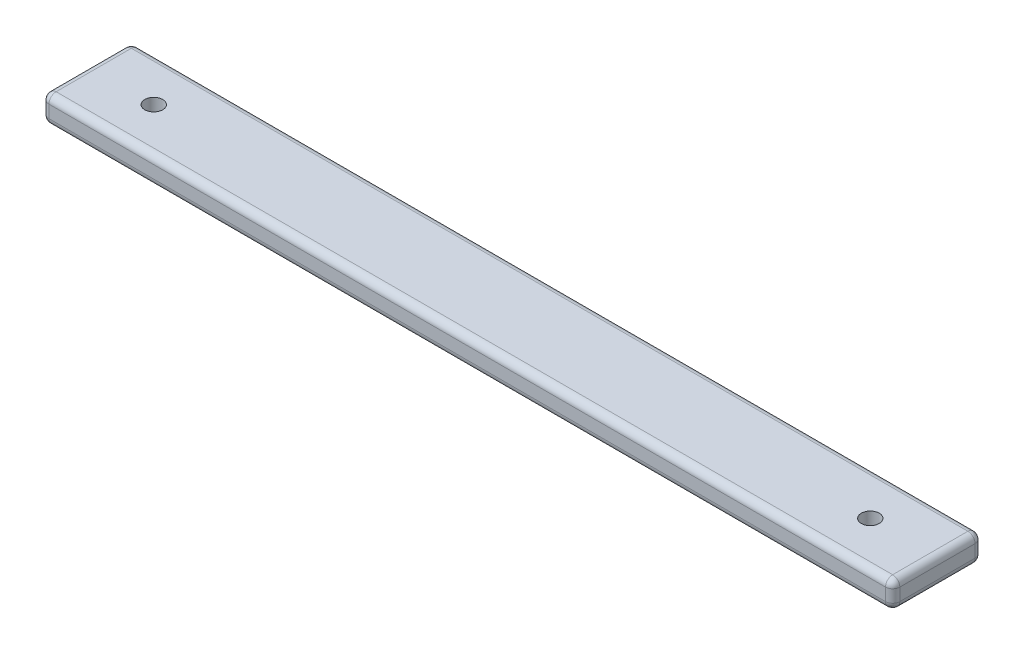
ISO-10303-21;
HEADER;
FILE_DESCRIPTION(('STEP AP214'),'2;1');
FILE_NAME('part.step','',(''),(''),'','','');
FILE_SCHEMA(('AUTOMOTIVE_DESIGN { 1 0 10303 214 1 1 1 1 }'));
ENDSEC;
DATA;
#1=APPLICATION_CONTEXT('core data for automotive mechanical design processes');
#2=APPLICATION_PROTOCOL_DEFINITION('international standard','automotive_design',2000,#1);
#3=PRODUCT_CONTEXT('',#1,'mechanical');
#4=PRODUCT('Part','Part','',(#3));
#5=PRODUCT_RELATED_PRODUCT_CATEGORY('part','',(#4));
#6=PRODUCT_DEFINITION_FORMATION('','',#4);
#7=PRODUCT_DEFINITION_CONTEXT('part definition',#1,'design');
#8=PRODUCT_DEFINITION('design','',#6,#7);
#9=PRODUCT_DEFINITION_SHAPE('','',#8);
#10=(LENGTH_UNIT() NAMED_UNIT(*) SI_UNIT(.MILLI.,.METRE.));
#11=(NAMED_UNIT(*) PLANE_ANGLE_UNIT() SI_UNIT($,.RADIAN.));
#12=(NAMED_UNIT(*) SI_UNIT($,.STERADIAN.) SOLID_ANGLE_UNIT());
#13=UNCERTAINTY_MEASURE_WITH_UNIT(LENGTH_MEASURE(1.E-05),#10,'distance_accuracy_value','');
#14=(GEOMETRIC_REPRESENTATION_CONTEXT(3) GLOBAL_UNCERTAINTY_ASSIGNED_CONTEXT((#13)) GLOBAL_UNIT_ASSIGNED_CONTEXT((#10,
#11,#12)) REPRESENTATION_CONTEXT('',''));
#15=CARTESIAN_POINT('',(0.,0.,0.));
#16=DIRECTION('',(0.,0.,1.));
#17=DIRECTION('',(1.,0.,0.));
#18=AXIS2_PLACEMENT_3D('',#15,#16,#17);
#19=CARTESIAN_POINT('',(47.5,3.,-5.));
#20=DIRECTION('',(-1.,0.,0.));
#21=DIRECTION('',(0.,0.,1.));
#22=AXIS2_PLACEMENT_3D('',#19,#20,#21);
#23=PLANE('',#22);
#24=DIRECTION('',(0.,0.,-1.));
#25=VECTOR('',#24,1.);
#26=CARTESIAN_POINT('',(47.5,2.2,5.));
#27=LINE('',#26,#25);
#28=CARTESIAN_POINT('',(47.5,2.2,-4.2));
#29=VERTEX_POINT('',#28);
#30=CARTESIAN_POINT('',(47.5,2.2,4.2));
#31=VERTEX_POINT('',#30);
#32=EDGE_CURVE('E234',#29,#31,#27,.F.);
#33=ORIENTED_EDGE('',*,*,#32,.T.);
#34=DIRECTION('',(0.,-1.,0.));
#35=VECTOR('',#34,1.);
#36=CARTESIAN_POINT('',(47.5,3.,4.2));
#37=LINE('',#36,#35);
#38=CARTESIAN_POINT('',(47.5,0.8,4.2));
#39=VERTEX_POINT('',#38);
#40=EDGE_CURVE('E11',#31,#39,#37,.T.);
#41=ORIENTED_EDGE('',*,*,#40,.T.);
#42=DIRECTION('',(0.,0.,-1.));
#43=VECTOR('',#42,1.);
#44=CARTESIAN_POINT('',(47.5,0.8,-5.));
#45=LINE('',#44,#43);
#46=CARTESIAN_POINT('',(47.5,0.8,-4.2));
#47=VERTEX_POINT('',#46);
#48=EDGE_CURVE('E236',#39,#47,#45,.T.);
#49=ORIENTED_EDGE('',*,*,#48,.T.);
#50=DIRECTION('',(0.,-1.,0.));
#51=VECTOR('',#50,1.);
#52=CARTESIAN_POINT('',(47.5,3.,-4.2));
#53=LINE('',#52,#51);
#54=EDGE_CURVE('E44',#47,#29,#53,.F.);
#55=ORIENTED_EDGE('',*,*,#54,.T.);
#56=EDGE_LOOP('',(#33,#41,#49,#55));
#57=FACE_BOUND('',#56,.T.);
#58=ADVANCED_FACE('F35',(#57),#23,.F.);
#59=CARTESIAN_POINT('',(-47.5,3.,-5.));
#60=DIRECTION('',(0.,0.,1.));
#61=DIRECTION('',(1.,0.,0.));
#62=AXIS2_PLACEMENT_3D('',#59,#60,#61);
#63=PLANE('',#62);
#64=DIRECTION('',(-1.,0.,0.));
#65=VECTOR('',#64,1.);
#66=CARTESIAN_POINT('',(-47.5,0.8,-5.));
#67=LINE('',#66,#65);
#68=CARTESIAN_POINT('',(46.7,0.8,-5.));
#69=VERTEX_POINT('',#68);
#70=CARTESIAN_POINT('',(-46.7,0.8,-5.));
#71=VERTEX_POINT('',#70);
#72=EDGE_CURVE('E133',#69,#71,#67,.T.);
#73=ORIENTED_EDGE('',*,*,#72,.T.);
#74=DIRECTION('',(0.,-1.,0.));
#75=VECTOR('',#74,1.);
#76=CARTESIAN_POINT('',(-46.7,3.,-5.));
#77=LINE('',#76,#75);
#78=CARTESIAN_POINT('',(-46.7,2.2,-5.));
#79=VERTEX_POINT('',#78);
#80=EDGE_CURVE('E175',#71,#79,#77,.F.);
#81=ORIENTED_EDGE('',*,*,#80,.T.);
#82=DIRECTION('',(-1.,0.,0.));
#83=VECTOR('',#82,1.);
#84=CARTESIAN_POINT('',(47.5,2.2,-5.));
#85=LINE('',#84,#83);
#86=CARTESIAN_POINT('',(46.7,2.2,-5.));
#87=VERTEX_POINT('',#86);
#88=EDGE_CURVE('E184',#79,#87,#85,.F.);
#89=ORIENTED_EDGE('',*,*,#88,.T.);
#90=DIRECTION('',(0.,-1.,0.));
#91=VECTOR('',#90,1.);
#92=CARTESIAN_POINT('',(46.7,3.,-5.));
#93=LINE('',#92,#91);
#94=EDGE_CURVE('E173',#87,#69,#93,.T.);
#95=ORIENTED_EDGE('',*,*,#94,.T.);
#96=EDGE_LOOP('',(#73,#81,#89,#95));
#97=FACE_BOUND('',#96,.T.);
#98=ADVANCED_FACE('F340',(#97),#63,.F.);
#99=CARTESIAN_POINT('',(-47.5,3.,-5.));
#100=DIRECTION('',(1.,0.,0.));
#101=DIRECTION('',(0.,0.,-1.));
#102=AXIS2_PLACEMENT_3D('',#99,#100,#101);
#103=PLANE('',#102);
#104=DIRECTION('',(0.,0.,1.));
#105=VECTOR('',#104,1.);
#106=CARTESIAN_POINT('',(-47.5,0.8,-5.));
#107=LINE('',#106,#105);
#108=CARTESIAN_POINT('',(-47.5,0.8,-4.2));
#109=VERTEX_POINT('',#108);
#110=CARTESIAN_POINT('',(-47.5,0.8,4.2));
#111=VERTEX_POINT('',#110);
#112=EDGE_CURVE('E225',#109,#111,#107,.T.);
#113=ORIENTED_EDGE('',*,*,#112,.T.);
#114=DIRECTION('',(0.,-1.,0.));
#115=VECTOR('',#114,1.);
#116=CARTESIAN_POINT('',(-47.5,3.,4.2));
#117=LINE('',#116,#115);
#118=CARTESIAN_POINT('',(-47.5,2.2,4.2));
#119=VERTEX_POINT('',#118);
#120=EDGE_CURVE('E171',#111,#119,#117,.F.);
#121=ORIENTED_EDGE('',*,*,#120,.T.);
#122=DIRECTION('',(0.,0.,1.));
#123=VECTOR('',#122,1.);
#124=CARTESIAN_POINT('',(-47.5,2.2,-5.));
#125=LINE('',#124,#123);
#126=CARTESIAN_POINT('',(-47.5,2.2,-4.2));
#127=VERTEX_POINT('',#126);
#128=EDGE_CURVE('E155',#119,#127,#125,.F.);
#129=ORIENTED_EDGE('',*,*,#128,.T.);
#130=DIRECTION('',(0.,-1.,0.));
#131=VECTOR('',#130,1.);
#132=CARTESIAN_POINT('',(-47.5,3.,-4.2));
#133=LINE('',#132,#131);
#134=EDGE_CURVE('E169',#127,#109,#133,.T.);
#135=ORIENTED_EDGE('',*,*,#134,.T.);
#136=EDGE_LOOP('',(#113,#121,#129,#135));
#137=FACE_BOUND('',#136,.T.);
#138=ADVANCED_FACE('F301',(#137),#103,.F.);
#139=CARTESIAN_POINT('',(-47.5,3.,5.));
#140=DIRECTION('',(0.,0.,-1.));
#141=DIRECTION('',(-1.,0.,0.));
#142=AXIS2_PLACEMENT_3D('',#139,#140,#141);
#143=PLANE('',#142);
#144=DIRECTION('',(1.,0.,0.));
#145=VECTOR('',#144,1.);
#146=CARTESIAN_POINT('',(-47.5,2.2,5.));
#147=LINE('',#146,#145);
#148=CARTESIAN_POINT('',(46.7,2.2,5.));
#149=VERTEX_POINT('',#148);
#150=CARTESIAN_POINT('',(-46.7,2.2,5.));
#151=VERTEX_POINT('',#150);
#152=EDGE_CURVE('E228',#149,#151,#147,.F.);
#153=ORIENTED_EDGE('',*,*,#152,.T.);
#154=DIRECTION('',(0.,-1.,0.));
#155=VECTOR('',#154,1.);
#156=CARTESIAN_POINT('',(-46.7,3.,5.));
#157=LINE('',#156,#155);
#158=CARTESIAN_POINT('',(-46.7,0.8,5.));
#159=VERTEX_POINT('',#158);
#160=EDGE_CURVE('E167',#151,#159,#157,.T.);
#161=ORIENTED_EDGE('',*,*,#160,.T.);
#162=DIRECTION('',(1.,0.,0.));
#163=VECTOR('',#162,1.);
#164=CARTESIAN_POINT('',(-47.5,0.8,5.));
#165=LINE('',#164,#163);
#166=CARTESIAN_POINT('',(46.7,0.8,5.));
#167=VERTEX_POINT('',#166);
#168=EDGE_CURVE('E231',#159,#167,#165,.T.);
#169=ORIENTED_EDGE('',*,*,#168,.T.);
#170=DIRECTION('',(0.,-1.,0.));
#171=VECTOR('',#170,1.);
#172=CARTESIAN_POINT('',(46.7,3.,5.));
#173=LINE('',#172,#171);
#174=EDGE_CURVE('E160',#167,#149,#173,.F.);
#175=ORIENTED_EDGE('',*,*,#174,.T.);
#176=EDGE_LOOP('',(#153,#161,#169,#175));
#177=FACE_BOUND('',#176,.T.);
#178=ADVANCED_FACE('F330',(#177),#143,.F.);
#179=CARTESIAN_POINT('',(0.,3.,0.));
#180=DIRECTION('',(0.,1.,0.));
#181=DIRECTION('',(0.,0.,1.));
#182=AXIS2_PLACEMENT_3D('',#179,#180,#181);
#183=PLANE('',#182);
#184=CARTESIAN_POINT('',(40.,3.,0.));
#185=DIRECTION('',(0.,1.,0.));
#186=DIRECTION('',(0.,0.,1.));
#187=AXIS2_PLACEMENT_3D('',#184,#185,#186);
#188=CIRCLE('',#187,0.999999999999998);
#189=CARTESIAN_POINT('',(40.,3.,0.999999999999983));
#190=VERTEX_POINT('',#189);
#191=EDGE_CURVE('E214',#190,#190,#188,.T.);
#192=ORIENTED_EDGE('',*,*,#191,.F.);
#193=EDGE_LOOP('',(#192));
#194=FACE_BOUND('',#193,.T.);
#195=CARTESIAN_POINT('',(-40.,3.,0.));
#196=DIRECTION('',(0.,1.,0.));
#197=DIRECTION('',(0.,0.,1.));
#198=AXIS2_PLACEMENT_3D('',#195,#196,#197);
#199=CIRCLE('',#198,0.999999999999998);
#200=CARTESIAN_POINT('',(-40.,3.,0.999999999999998));
#201=VERTEX_POINT('',#200);
#202=EDGE_CURVE('E201',#201,#201,#199,.T.);
#203=ORIENTED_EDGE('',*,*,#202,.F.);
#204=EDGE_LOOP('',(#203));
#205=FACE_BOUND('',#204,.T.);
#206=DIRECTION('',(0.,0.,1.));
#207=VECTOR('',#206,1.);
#208=CARTESIAN_POINT('',(-46.7,3.,5.));
#209=LINE('',#208,#207);
#210=CARTESIAN_POINT('',(-46.7,3.,-4.2));
#211=VERTEX_POINT('',#210);
#212=CARTESIAN_POINT('',(-46.7,3.,4.2));
#213=VERTEX_POINT('',#212);
#214=EDGE_CURVE('E244',#211,#213,#209,.T.);
#215=ORIENTED_EDGE('',*,*,#214,.T.);
#216=DIRECTION('',(1.,0.,0.));
#217=VECTOR('',#216,1.);
#218=CARTESIAN_POINT('',(47.5,3.,4.2));
#219=LINE('',#218,#217);
#220=CARTESIAN_POINT('',(46.7,3.,4.2));
#221=VERTEX_POINT('',#220);
#222=EDGE_CURVE('E247',#213,#221,#219,.T.);
#223=ORIENTED_EDGE('',*,*,#222,.T.);
#224=DIRECTION('',(0.,0.,-1.));
#225=VECTOR('',#224,1.);
#226=CARTESIAN_POINT('',(46.7,3.,-5.));
#227=LINE('',#226,#225);
#228=CARTESIAN_POINT('',(46.7,3.,-4.2));
#229=VERTEX_POINT('',#228);
#230=EDGE_CURVE('E238',#221,#229,#227,.T.);
#231=ORIENTED_EDGE('',*,*,#230,.T.);
#232=DIRECTION('',(-1.,0.,0.));
#233=VECTOR('',#232,1.);
#234=CARTESIAN_POINT('',(-47.5,3.,-4.2));
#235=LINE('',#234,#233);
#236=EDGE_CURVE('E241',#229,#211,#235,.T.);
#237=ORIENTED_EDGE('',*,*,#236,.T.);
#238=EDGE_LOOP('',(#215,#223,#231,#237));
#239=FACE_BOUND('',#238,.T.);
#240=ADVANCED_FACE('F279',(#194,#205,#239),#183,.T.);
#241=CARTESIAN_POINT('',(0.,0.,0.));
#242=DIRECTION('',(0.,1.,0.));
#243=DIRECTION('',(0.,0.,1.));
#244=AXIS2_PLACEMENT_3D('',#241,#242,#243);
#245=PLANE('',#244);
#246=CARTESIAN_POINT('',(40.,0.,0.));
#247=DIRECTION('',(0.,1.,0.));
#248=DIRECTION('',(0.,0.,1.));
#249=AXIS2_PLACEMENT_3D('',#246,#247,#248);
#250=CIRCLE('',#249,0.999999999999998);
#251=CARTESIAN_POINT('',(40.,0.,0.999999999999983));
#252=VERTEX_POINT('',#251);
#253=EDGE_CURVE('E206',#252,#252,#250,.T.);
#254=ORIENTED_EDGE('',*,*,#253,.T.);
#255=EDGE_LOOP('',(#254));
#256=FACE_BOUND('',#255,.T.);
#257=CARTESIAN_POINT('',(-40.,0.,0.));
#258=DIRECTION('',(0.,1.,0.));
#259=DIRECTION('',(0.,0.,1.));
#260=AXIS2_PLACEMENT_3D('',#257,#258,#259);
#261=CIRCLE('',#260,0.999999999999998);
#262=CARTESIAN_POINT('',(-40.,0.,0.999999999999998));
#263=VERTEX_POINT('',#262);
#264=EDGE_CURVE('E196',#263,#263,#261,.T.);
#265=ORIENTED_EDGE('',*,*,#264,.T.);
#266=EDGE_LOOP('',(#265));
#267=FACE_BOUND('',#266,.T.);
#268=DIRECTION('',(0.,0.,1.));
#269=VECTOR('',#268,1.);
#270=CARTESIAN_POINT('',(-46.7,0.,0.));
#271=LINE('',#270,#269);
#272=CARTESIAN_POINT('',(-46.7,0.,4.2));
#273=VERTEX_POINT('',#272);
#274=CARTESIAN_POINT('',(-46.7,0.,-4.2));
#275=VERTEX_POINT('',#274);
#276=EDGE_CURVE('E154',#273,#275,#271,.F.);
#277=ORIENTED_EDGE('',*,*,#276,.T.);
#278=DIRECTION('',(-1.,0.,0.));
#279=VECTOR('',#278,1.);
#280=CARTESIAN_POINT('',(0.,0.,-4.2));
#281=LINE('',#280,#279);
#282=CARTESIAN_POINT('',(46.7,0.,-4.2));
#283=VERTEX_POINT('',#282);
#284=EDGE_CURVE('E130',#275,#283,#281,.F.);
#285=ORIENTED_EDGE('',*,*,#284,.T.);
#286=DIRECTION('',(0.,0.,-1.));
#287=VECTOR('',#286,1.);
#288=CARTESIAN_POINT('',(46.7,0.,0.));
#289=LINE('',#288,#287);
#290=CARTESIAN_POINT('',(46.7,0.,4.2));
#291=VERTEX_POINT('',#290);
#292=EDGE_CURVE('E141',#283,#291,#289,.F.);
#293=ORIENTED_EDGE('',*,*,#292,.T.);
#294=DIRECTION('',(1.,0.,0.));
#295=VECTOR('',#294,1.);
#296=CARTESIAN_POINT('',(0.,0.,4.2));
#297=LINE('',#296,#295);
#298=EDGE_CURVE('E148',#291,#273,#297,.F.);
#299=ORIENTED_EDGE('',*,*,#298,.T.);
#300=EDGE_LOOP('',(#277,#285,#293,#299));
#301=FACE_BOUND('',#300,.T.);
#302=CARTESIAN_POINT('',(0.,0.,0.));
#303=DIRECTION('',(0.,1.,0.));
#304=DIRECTION('',(0.,0.,1.));
#305=AXIS2_PLACEMENT_3D('',#302,#303,#304);
#306=CIRCLE('',#305,0.678596161892558);
#307=CARTESIAN_POINT('',(0.,0.,-0.678596161892558));
#308=VERTEX_POINT('',#307);
#309=EDGE_CURVE('E217',#308,#308,#306,.F.);
#310=ORIENTED_EDGE('',*,*,#309,.F.);
#311=EDGE_LOOP('',(#310));
#312=FACE_BOUND('',#311,.T.);
#313=ADVANCED_FACE('F151',(#256,#267,#301,#312),#245,.F.);
#314=CARTESIAN_POINT('',(-47.5,0.8,4.2));
#315=DIRECTION('',(1.,0.,0.));
#316=DIRECTION('',(0.,0.,-1.));
#317=AXIS2_PLACEMENT_3D('',#314,#315,#316);
#318=CYLINDRICAL_SURFACE('',#317,0.8);
#319=ORIENTED_EDGE('',*,*,#168,.F.);
#320=CARTESIAN_POINT('',(-46.7,0.8,4.2));
#321=DIRECTION('',(1.,0.,0.));
#322=DIRECTION('',(0.,0.,-1.));
#323=AXIS2_PLACEMENT_3D('',#320,#321,#322);
#324=CIRCLE('',#323,0.8);
#325=EDGE_CURVE('E267',#159,#273,#324,.T.);
#326=ORIENTED_EDGE('',*,*,#325,.T.);
#327=ORIENTED_EDGE('',*,*,#298,.F.);
#328=CARTESIAN_POINT('',(46.7,0.8,4.2));
#329=DIRECTION('',(1.,0.,0.));
#330=DIRECTION('',(0.,0.,-1.));
#331=AXIS2_PLACEMENT_3D('',#328,#329,#330);
#332=CIRCLE('',#331,0.8);
#333=EDGE_CURVE('E265',#291,#167,#332,.F.);
#334=ORIENTED_EDGE('',*,*,#333,.T.);
#335=EDGE_LOOP('',(#319,#326,#327,#334));
#336=FACE_BOUND('',#335,.T.);
#337=ADVANCED_FACE('F327',(#336),#318,.T.);
#338=CARTESIAN_POINT('',(46.7,0.8,-5.));
#339=DIRECTION('',(0.,0.,-1.));
#340=DIRECTION('',(-1.,0.,0.));
#341=AXIS2_PLACEMENT_3D('',#338,#339,#340);
#342=CYLINDRICAL_SURFACE('',#341,0.8);
#343=ORIENTED_EDGE('',*,*,#48,.F.);
#344=CARTESIAN_POINT('',(46.7,0.8,4.2));
#345=DIRECTION('',(0.,0.,-1.));
#346=DIRECTION('',(-1.,0.,0.));
#347=AXIS2_PLACEMENT_3D('',#344,#345,#346);
#348=CIRCLE('',#347,0.8);
#349=EDGE_CURVE('E144',#39,#291,#348,.T.);
#350=ORIENTED_EDGE('',*,*,#349,.T.);
#351=ORIENTED_EDGE('',*,*,#292,.F.);
#352=CARTESIAN_POINT('',(46.7,0.8,-4.2));
#353=DIRECTION('',(0.,0.,-1.));
#354=DIRECTION('',(-1.,0.,0.));
#355=AXIS2_PLACEMENT_3D('',#352,#353,#354);
#356=CIRCLE('',#355,0.8);
#357=EDGE_CURVE('E52',#283,#47,#356,.F.);
#358=ORIENTED_EDGE('',*,*,#357,.T.);
#359=EDGE_LOOP('',(#343,#350,#351,#358));
#360=FACE_BOUND('',#359,.T.);
#361=ADVANCED_FACE('F142',(#360),#342,.T.);
#362=CARTESIAN_POINT('',(-46.7,0.8,-5.));
#363=DIRECTION('',(0.,0.,1.));
#364=DIRECTION('',(1.,0.,0.));
#365=AXIS2_PLACEMENT_3D('',#362,#363,#364);
#366=CYLINDRICAL_SURFACE('',#365,0.8);
#367=ORIENTED_EDGE('',*,*,#276,.F.);
#368=CARTESIAN_POINT('',(-46.7,0.8,4.2));
#369=DIRECTION('',(0.,0.,1.));
#370=DIRECTION('',(1.,0.,0.));
#371=AXIS2_PLACEMENT_3D('',#368,#369,#370);
#372=CIRCLE('',#371,0.8);
#373=EDGE_CURVE('E263',#273,#111,#372,.F.);
#374=ORIENTED_EDGE('',*,*,#373,.T.);
#375=ORIENTED_EDGE('',*,*,#112,.F.);
#376=CARTESIAN_POINT('',(-46.7,0.8,-4.2));
#377=DIRECTION('',(0.,0.,1.));
#378=DIRECTION('',(1.,0.,0.));
#379=AXIS2_PLACEMENT_3D('',#376,#377,#378);
#380=CIRCLE('',#379,0.8);
#381=EDGE_CURVE('E261',#109,#275,#380,.T.);
#382=ORIENTED_EDGE('',*,*,#381,.T.);
#383=EDGE_LOOP('',(#367,#374,#375,#382));
#384=FACE_BOUND('',#383,.T.);
#385=ADVANCED_FACE('F353',(#384),#366,.T.);
#386=CARTESIAN_POINT('',(-47.5,0.8,-4.2));
#387=DIRECTION('',(-1.,0.,0.));
#388=DIRECTION('',(0.,0.,1.));
#389=AXIS2_PLACEMENT_3D('',#386,#387,#388);
#390=CYLINDRICAL_SURFACE('',#389,0.8);
#391=ORIENTED_EDGE('',*,*,#284,.F.);
#392=CARTESIAN_POINT('',(-46.7,0.8,-4.2));
#393=DIRECTION('',(-1.,0.,0.));
#394=DIRECTION('',(0.,0.,1.));
#395=AXIS2_PLACEMENT_3D('',#392,#393,#394);
#396=CIRCLE('',#395,0.8);
#397=EDGE_CURVE('E137',#275,#71,#396,.F.);
#398=ORIENTED_EDGE('',*,*,#397,.T.);
#399=ORIENTED_EDGE('',*,*,#72,.F.);
#400=CARTESIAN_POINT('',(46.7,0.8,-4.2));
#401=DIRECTION('',(-1.,0.,0.));
#402=DIRECTION('',(0.,0.,1.));
#403=AXIS2_PLACEMENT_3D('',#400,#401,#402);
#404=CIRCLE('',#403,0.8);
#405=EDGE_CURVE('E127',#69,#283,#404,.T.);
#406=ORIENTED_EDGE('',*,*,#405,.T.);
#407=EDGE_LOOP('',(#391,#398,#399,#406));
#408=FACE_BOUND('',#407,.T.);
#409=ADVANCED_FACE('F128',(#408),#390,.T.);
#410=CARTESIAN_POINT('',(0.,2.2,-4.2));
#411=DIRECTION('',(1.,0.,0.));
#412=DIRECTION('',(0.,0.,-1.));
#413=AXIS2_PLACEMENT_3D('',#410,#411,#412);
#414=CYLINDRICAL_SURFACE('',#413,0.8);
#415=ORIENTED_EDGE('',*,*,#88,.F.);
#416=CARTESIAN_POINT('',(-46.7,2.2,-4.2));
#417=DIRECTION('',(1.,0.,0.));
#418=DIRECTION('',(0.,0.,-1.));
#419=AXIS2_PLACEMENT_3D('',#416,#417,#418);
#420=CIRCLE('',#419,0.8);
#421=EDGE_CURVE('E138',#79,#211,#420,.T.);
#422=ORIENTED_EDGE('',*,*,#421,.T.);
#423=ORIENTED_EDGE('',*,*,#236,.F.);
#424=CARTESIAN_POINT('',(46.7,2.2,-4.2));
#425=DIRECTION('',(1.,0.,0.));
#426=DIRECTION('',(0.,0.,-1.));
#427=AXIS2_PLACEMENT_3D('',#424,#425,#426);
#428=CIRCLE('',#427,0.8);
#429=EDGE_CURVE('E269',#229,#87,#428,.F.);
#430=ORIENTED_EDGE('',*,*,#429,.T.);
#431=EDGE_LOOP('',(#415,#422,#423,#430));
#432=FACE_BOUND('',#431,.T.);
#433=ADVANCED_FACE('F284',(#432),#414,.T.);
#434=CARTESIAN_POINT('',(-46.7,2.2,0.));
#435=DIRECTION('',(0.,0.,-1.));
#436=DIRECTION('',(-1.,0.,0.));
#437=AXIS2_PLACEMENT_3D('',#434,#435,#436);
#438=CYLINDRICAL_SURFACE('',#437,0.8);
#439=ORIENTED_EDGE('',*,*,#128,.F.);
#440=CARTESIAN_POINT('',(-46.7,2.2,4.2));
#441=DIRECTION('',(0.,0.,-1.));
#442=DIRECTION('',(-1.,0.,0.));
#443=AXIS2_PLACEMENT_3D('',#440,#441,#442);
#444=CIRCLE('',#443,0.8);
#445=EDGE_CURVE('E259',#119,#213,#444,.T.);
#446=ORIENTED_EDGE('',*,*,#445,.T.);
#447=ORIENTED_EDGE('',*,*,#214,.F.);
#448=CARTESIAN_POINT('',(-46.7,2.2,-4.2));
#449=DIRECTION('',(0.,0.,-1.));
#450=DIRECTION('',(-1.,0.,0.));
#451=AXIS2_PLACEMENT_3D('',#448,#449,#450);
#452=CIRCLE('',#451,0.8);
#453=EDGE_CURVE('E256',#211,#127,#452,.F.);
#454=ORIENTED_EDGE('',*,*,#453,.T.);
#455=EDGE_LOOP('',(#439,#446,#447,#454));
#456=FACE_BOUND('',#455,.T.);
#457=ADVANCED_FACE('F299',(#456),#438,.T.);
#458=CARTESIAN_POINT('',(46.7,2.2,0.));
#459=DIRECTION('',(0.,0.,1.));
#460=DIRECTION('',(1.,0.,0.));
#461=AXIS2_PLACEMENT_3D('',#458,#459,#460);
#462=CYLINDRICAL_SURFACE('',#461,0.8);
#463=ORIENTED_EDGE('',*,*,#230,.F.);
#464=CARTESIAN_POINT('',(46.7,2.2,4.2));
#465=DIRECTION('',(0.,0.,1.));
#466=DIRECTION('',(1.,0.,0.));
#467=AXIS2_PLACEMENT_3D('',#464,#465,#466);
#468=CIRCLE('',#467,0.8);
#469=EDGE_CURVE('E158',#221,#31,#468,.F.);
#470=ORIENTED_EDGE('',*,*,#469,.T.);
#471=ORIENTED_EDGE('',*,*,#32,.F.);
#472=CARTESIAN_POINT('',(46.7,2.2,-4.2));
#473=DIRECTION('',(0.,0.,1.));
#474=DIRECTION('',(1.,0.,0.));
#475=AXIS2_PLACEMENT_3D('',#472,#473,#474);
#476=CIRCLE('',#475,0.8);
#477=EDGE_CURVE('E162',#29,#229,#476,.T.);
#478=ORIENTED_EDGE('',*,*,#477,.T.);
#479=EDGE_LOOP('',(#463,#470,#471,#478));
#480=FACE_BOUND('',#479,.T.);
#481=ADVANCED_FACE('F276',(#480),#462,.T.);
#482=CARTESIAN_POINT('',(0.,2.2,4.2));
#483=DIRECTION('',(-1.,0.,0.));
#484=DIRECTION('',(0.,0.,1.));
#485=AXIS2_PLACEMENT_3D('',#482,#483,#484);
#486=CYLINDRICAL_SURFACE('',#485,0.8);
#487=ORIENTED_EDGE('',*,*,#222,.F.);
#488=CARTESIAN_POINT('',(-46.7,2.2,4.2));
#489=DIRECTION('',(-1.,0.,0.));
#490=DIRECTION('',(0.,0.,1.));
#491=AXIS2_PLACEMENT_3D('',#488,#489,#490);
#492=CIRCLE('',#491,0.8);
#493=EDGE_CURVE('E253',#213,#151,#492,.F.);
#494=ORIENTED_EDGE('',*,*,#493,.T.);
#495=ORIENTED_EDGE('',*,*,#152,.F.);
#496=CARTESIAN_POINT('',(46.7,2.2,4.2));
#497=DIRECTION('',(-1.,0.,0.));
#498=DIRECTION('',(0.,0.,1.));
#499=AXIS2_PLACEMENT_3D('',#496,#497,#498);
#500=CIRCLE('',#499,0.8);
#501=EDGE_CURVE('E250',#149,#221,#500,.T.);
#502=ORIENTED_EDGE('',*,*,#501,.T.);
#503=EDGE_LOOP('',(#487,#494,#495,#502));
#504=FACE_BOUND('',#503,.T.);
#505=ADVANCED_FACE('F312',(#504),#486,.T.);
#506=CARTESIAN_POINT('',(-46.7,0.8,4.2));
#507=DIRECTION('',(0.,0.,1.));
#508=DIRECTION('',(1.,0.,0.));
#509=AXIS2_PLACEMENT_3D('',#506,#507,#508);
#510=SPHERICAL_SURFACE('',#509,0.8);
#511=ORIENTED_EDGE('',*,*,#373,.F.);
#512=ORIENTED_EDGE('',*,*,#325,.F.);
#513=CARTESIAN_POINT('',(-46.7,0.8,4.2));
#514=DIRECTION('',(0.,1.,0.));
#515=DIRECTION('',(0.,0.,1.));
#516=AXIS2_PLACEMENT_3D('',#513,#514,#515);
#517=CIRCLE('',#516,0.8);
#518=EDGE_CURVE('E180',#111,#159,#517,.T.);
#519=ORIENTED_EDGE('',*,*,#518,.F.);
#520=EDGE_LOOP('',(#511,#512,#519));
#521=FACE_BOUND('',#520,.T.);
#522=ADVANCED_FACE('F362',(#521),#510,.T.);
#523=CARTESIAN_POINT('',(-46.7,3.,4.2));
#524=DIRECTION('',(0.,-1.,0.));
#525=DIRECTION('',(0.,0.,-1.));
#526=AXIS2_PLACEMENT_3D('',#523,#524,#525);
#527=CYLINDRICAL_SURFACE('',#526,0.8);
#528=ORIENTED_EDGE('',*,*,#518,.T.);
#529=ORIENTED_EDGE('',*,*,#160,.F.);
#530=CARTESIAN_POINT('',(-46.7,2.2,4.2));
#531=DIRECTION('',(0.,1.,0.));
#532=DIRECTION('',(0.,0.,1.));
#533=AXIS2_PLACEMENT_3D('',#530,#531,#532);
#534=CIRCLE('',#533,0.8);
#535=EDGE_CURVE('E178',#119,#151,#534,.T.);
#536=ORIENTED_EDGE('',*,*,#535,.F.);
#537=ORIENTED_EDGE('',*,*,#120,.F.);
#538=EDGE_LOOP('',(#528,#529,#536,#537));
#539=FACE_BOUND('',#538,.T.);
#540=ADVANCED_FACE('F306',(#539),#527,.T.);
#541=CARTESIAN_POINT('',(-46.7,2.2,4.2));
#542=DIRECTION('',(0.,0.,1.));
#543=DIRECTION('',(1.,0.,0.));
#544=AXIS2_PLACEMENT_3D('',#541,#542,#543);
#545=SPHERICAL_SURFACE('',#544,0.8);
#546=ORIENTED_EDGE('',*,*,#493,.F.);
#547=ORIENTED_EDGE('',*,*,#445,.F.);
#548=ORIENTED_EDGE('',*,*,#535,.T.);
#549=EDGE_LOOP('',(#546,#547,#548));
#550=FACE_BOUND('',#549,.T.);
#551=ADVANCED_FACE('F310',(#550),#545,.T.);
#552=CARTESIAN_POINT('',(-46.7,0.8,-4.2));
#553=DIRECTION('',(0.,0.,1.));
#554=DIRECTION('',(1.,0.,0.));
#555=AXIS2_PLACEMENT_3D('',#552,#553,#554);
#556=SPHERICAL_SURFACE('',#555,0.8);
#557=ORIENTED_EDGE('',*,*,#397,.F.);
#558=ORIENTED_EDGE('',*,*,#381,.F.);
#559=CARTESIAN_POINT('',(-46.7,0.8,-4.2));
#560=DIRECTION('',(0.,1.,0.));
#561=DIRECTION('',(0.,0.,1.));
#562=AXIS2_PLACEMENT_3D('',#559,#560,#561);
#563=CIRCLE('',#562,0.8);
#564=EDGE_CURVE('E181',#71,#109,#563,.T.);
#565=ORIENTED_EDGE('',*,*,#564,.F.);
#566=EDGE_LOOP('',(#557,#558,#565));
#567=FACE_BOUND('',#566,.T.);
#568=ADVANCED_FACE('F371',(#567),#556,.T.);
#569=CARTESIAN_POINT('',(-46.7,3.,-4.2));
#570=DIRECTION('',(0.,-1.,0.));
#571=DIRECTION('',(0.,0.,-1.));
#572=AXIS2_PLACEMENT_3D('',#569,#570,#571);
#573=CYLINDRICAL_SURFACE('',#572,0.8);
#574=ORIENTED_EDGE('',*,*,#564,.T.);
#575=ORIENTED_EDGE('',*,*,#134,.F.);
#576=CARTESIAN_POINT('',(-46.7,2.2,-4.2));
#577=DIRECTION('',(0.,1.,0.));
#578=DIRECTION('',(0.,0.,1.));
#579=AXIS2_PLACEMENT_3D('',#576,#577,#578);
#580=CIRCLE('',#579,0.8);
#581=EDGE_CURVE('E185',#79,#127,#580,.T.);
#582=ORIENTED_EDGE('',*,*,#581,.F.);
#583=ORIENTED_EDGE('',*,*,#80,.F.);
#584=EDGE_LOOP('',(#574,#575,#582,#583));
#585=FACE_BOUND('',#584,.T.);
#586=ADVANCED_FACE('F293',(#585),#573,.T.);
#587=CARTESIAN_POINT('',(-46.7,2.2,-4.2));
#588=DIRECTION('',(0.,0.,1.));
#589=DIRECTION('',(1.,0.,0.));
#590=AXIS2_PLACEMENT_3D('',#587,#588,#589);
#591=SPHERICAL_SURFACE('',#590,0.8);
#592=ORIENTED_EDGE('',*,*,#453,.F.);
#593=ORIENTED_EDGE('',*,*,#421,.F.);
#594=ORIENTED_EDGE('',*,*,#581,.T.);
#595=EDGE_LOOP('',(#592,#593,#594));
#596=FACE_BOUND('',#595,.T.);
#597=ADVANCED_FACE('F289',(#596),#591,.T.);
#598=CARTESIAN_POINT('',(46.7,0.8,4.2));
#599=DIRECTION('',(0.,0.,1.));
#600=DIRECTION('',(1.,0.,0.));
#601=AXIS2_PLACEMENT_3D('',#598,#599,#600);
#602=SPHERICAL_SURFACE('',#601,0.8);
#603=ORIENTED_EDGE('',*,*,#333,.F.);
#604=ORIENTED_EDGE('',*,*,#349,.F.);
#605=CARTESIAN_POINT('',(46.7,0.8,4.2));
#606=DIRECTION('',(0.,1.,0.));
#607=DIRECTION('',(0.,0.,1.));
#608=AXIS2_PLACEMENT_3D('',#605,#606,#607);
#609=CIRCLE('',#608,0.8);
#610=EDGE_CURVE('E187',#167,#39,#609,.T.);
#611=ORIENTED_EDGE('',*,*,#610,.F.);
#612=EDGE_LOOP('',(#603,#604,#611));
#613=FACE_BOUND('',#612,.T.);
#614=ADVANCED_FACE('F324',(#613),#602,.T.);
#615=CARTESIAN_POINT('',(46.7,3.,4.2));
#616=DIRECTION('',(0.,-1.,0.));
#617=DIRECTION('',(0.,0.,-1.));
#618=AXIS2_PLACEMENT_3D('',#615,#616,#617);
#619=CYLINDRICAL_SURFACE('',#618,0.8);
#620=ORIENTED_EDGE('',*,*,#610,.T.);
#621=ORIENTED_EDGE('',*,*,#40,.F.);
#622=CARTESIAN_POINT('',(46.7,2.2,4.2));
#623=DIRECTION('',(0.,1.,0.));
#624=DIRECTION('',(0.,0.,1.));
#625=AXIS2_PLACEMENT_3D('',#622,#623,#624);
#626=CIRCLE('',#625,0.8);
#627=EDGE_CURVE('E190',#149,#31,#626,.T.);
#628=ORIENTED_EDGE('',*,*,#627,.F.);
#629=ORIENTED_EDGE('',*,*,#174,.F.);
#630=EDGE_LOOP('',(#620,#621,#628,#629));
#631=FACE_BOUND('',#630,.T.);
#632=ADVANCED_FACE('F319',(#631),#619,.T.);
#633=CARTESIAN_POINT('',(46.7,2.2,4.2));
#634=DIRECTION('',(0.,0.,1.));
#635=DIRECTION('',(1.,0.,0.));
#636=AXIS2_PLACEMENT_3D('',#633,#634,#635);
#637=SPHERICAL_SURFACE('',#636,0.8);
#638=ORIENTED_EDGE('',*,*,#627,.T.);
#639=ORIENTED_EDGE('',*,*,#469,.F.);
#640=ORIENTED_EDGE('',*,*,#501,.F.);
#641=EDGE_LOOP('',(#638,#639,#640));
#642=FACE_BOUND('',#641,.T.);
#643=ADVANCED_FACE('F317',(#642),#637,.T.);
#644=CARTESIAN_POINT('',(46.7,0.8,-4.2));
#645=DIRECTION('',(0.,0.,1.));
#646=DIRECTION('',(1.,0.,0.));
#647=AXIS2_PLACEMENT_3D('',#644,#645,#646);
#648=SPHERICAL_SURFACE('',#647,0.8);
#649=ORIENTED_EDGE('',*,*,#357,.F.);
#650=ORIENTED_EDGE('',*,*,#405,.F.);
#651=CARTESIAN_POINT('',(46.7,0.8,-4.2));
#652=DIRECTION('',(0.,1.,0.));
#653=DIRECTION('',(0.,0.,1.));
#654=AXIS2_PLACEMENT_3D('',#651,#652,#653);
#655=CIRCLE('',#654,0.8);
#656=EDGE_CURVE('E39',#47,#69,#655,.T.);
#657=ORIENTED_EDGE('',*,*,#656,.F.);
#658=EDGE_LOOP('',(#649,#650,#657));
#659=FACE_BOUND('',#658,.T.);
#660=ADVANCED_FACE('F37',(#659),#648,.T.);
#661=CARTESIAN_POINT('',(46.7,3.,-4.2));
#662=DIRECTION('',(0.,-1.,0.));
#663=DIRECTION('',(0.,0.,-1.));
#664=AXIS2_PLACEMENT_3D('',#661,#662,#663);
#665=CYLINDRICAL_SURFACE('',#664,0.8);
#666=ORIENTED_EDGE('',*,*,#656,.T.);
#667=ORIENTED_EDGE('',*,*,#94,.F.);
#668=CARTESIAN_POINT('',(46.7,2.2,-4.2));
#669=DIRECTION('',(0.,1.,0.));
#670=DIRECTION('',(0.,0.,1.));
#671=AXIS2_PLACEMENT_3D('',#668,#669,#670);
#672=CIRCLE('',#671,0.8);
#673=EDGE_CURVE('E194',#29,#87,#672,.T.);
#674=ORIENTED_EDGE('',*,*,#673,.F.);
#675=ORIENTED_EDGE('',*,*,#54,.F.);
#676=EDGE_LOOP('',(#666,#667,#674,#675));
#677=FACE_BOUND('',#676,.T.);
#678=ADVANCED_FACE('F393',(#677),#665,.T.);
#679=CARTESIAN_POINT('',(46.7,2.2,-4.2));
#680=DIRECTION('',(0.,0.,1.));
#681=DIRECTION('',(1.,0.,0.));
#682=AXIS2_PLACEMENT_3D('',#679,#680,#681);
#683=SPHERICAL_SURFACE('',#682,0.8);
#684=ORIENTED_EDGE('',*,*,#673,.T.);
#685=ORIENTED_EDGE('',*,*,#429,.F.);
#686=ORIENTED_EDGE('',*,*,#477,.F.);
#687=EDGE_LOOP('',(#684,#685,#686));
#688=FACE_BOUND('',#687,.T.);
#689=ADVANCED_FACE('F390',(#688),#683,.T.);
#690=CARTESIAN_POINT('',(-40.,0.,0.));
#691=DIRECTION('',(0.,1.,0.));
#692=DIRECTION('',(0.,0.,1.));
#693=AXIS2_PLACEMENT_3D('',#690,#691,#692);
#694=CYLINDRICAL_SURFACE('',#693,0.999999999999998);
#695=ORIENTED_EDGE('',*,*,#264,.F.);
#696=EDGE_LOOP('',(#695));
#697=FACE_BOUND('',#696,.T.);
#698=ORIENTED_EDGE('',*,*,#202,.T.);
#699=EDGE_LOOP('',(#698));
#700=FACE_BOUND('',#699,.T.);
#701=ADVANCED_FACE('F392',(#697,#700),#694,.F.);
#702=CARTESIAN_POINT('',(40.,0.,0.));
#703=DIRECTION('',(0.,1.,0.));
#704=DIRECTION('',(0.,0.,1.));
#705=AXIS2_PLACEMENT_3D('',#702,#703,#704);
#706=CYLINDRICAL_SURFACE('',#705,0.999999999999998);
#707=ORIENTED_EDGE('',*,*,#253,.F.);
#708=EDGE_LOOP('',(#707));
#709=FACE_BOUND('',#708,.T.);
#710=ORIENTED_EDGE('',*,*,#191,.T.);
#711=EDGE_LOOP('',(#710));
#712=FACE_BOUND('',#711,.T.);
#713=ADVANCED_FACE('F525',(#709,#712),#706,.F.);
#714=CARTESIAN_POINT('',(0.,2.82842712474619,0.));
#715=DIRECTION('',(0.,-1.,0.));
#716=DIRECTION('',(0.,0.,-1.));
#717=AXIS2_PLACEMENT_3D('',#714,#715,#716);
#718=CYLINDRICAL_SURFACE('',#717,0.678596161892558);
#719=CARTESIAN_POINT('',(0.,-2.,0.));
#720=DIRECTION('',(0.,-1.,0.));
#721=DIRECTION('',(0.,0.,-1.));
#722=AXIS2_PLACEMENT_3D('',#719,#720,#721);
#723=CIRCLE('',#722,0.678596161892558);
#724=CARTESIAN_POINT('',(0.,-2.,-0.678596161892558));
#725=VERTEX_POINT('',#724);
#726=EDGE_CURVE('E209',#725,#725,#723,.T.);
#727=CARTESIAN_POINT('',(0.,-2.,-0.678596161892558));
#728=CARTESIAN_POINT('',(0.,-1.97916666666667,-0.678596161892558));
#729=CARTESIAN_POINT('',(0.,-1.95833333333333,-0.678596161892558));
#730=CARTESIAN_POINT('',(0.,-1.91666666666667,-0.678596161892558));
#731=CARTESIAN_POINT('',(0.,-1.89583333333333,-0.678596161892558));
#732=CARTESIAN_POINT('',(0.,-1.85416666666667,-0.678596161892558));
#733=CARTESIAN_POINT('',(0.,-1.83333333333333,-0.678596161892558));
#734=CARTESIAN_POINT('',(0.,-1.79166666666667,-0.678596161892558));
#735=CARTESIAN_POINT('',(0.,-1.77083333333333,-0.678596161892558));
#736=CARTESIAN_POINT('',(0.,-1.72916666666667,-0.678596161892558));
#737=CARTESIAN_POINT('',(0.,-1.70833333333333,-0.678596161892558));
#738=CARTESIAN_POINT('',(0.,-1.66666666666667,-0.678596161892558));
#739=CARTESIAN_POINT('',(0.,-1.64583333333333,-0.678596161892558));
#740=CARTESIAN_POINT('',(0.,-1.60416666666667,-0.678596161892558));
#741=CARTESIAN_POINT('',(0.,-1.58333333333333,-0.678596161892558));
#742=CARTESIAN_POINT('',(0.,-1.54166666666667,-0.678596161892558));
#743=CARTESIAN_POINT('',(0.,-1.52083333333333,-0.678596161892558));
#744=CARTESIAN_POINT('',(0.,-1.47916666666667,-0.678596161892558));
#745=CARTESIAN_POINT('',(0.,-1.45833333333333,-0.678596161892558));
#746=CARTESIAN_POINT('',(0.,-1.41666666666667,-0.678596161892558));
#747=CARTESIAN_POINT('',(0.,-1.39583333333333,-0.678596161892558));
#748=CARTESIAN_POINT('',(0.,-1.35416666666667,-0.678596161892558));
#749=CARTESIAN_POINT('',(0.,-1.33333333333333,-0.678596161892558));
#750=CARTESIAN_POINT('',(0.,-1.29166666666667,-0.678596161892558));
#751=CARTESIAN_POINT('',(0.,-1.27083333333333,-0.678596161892558));
#752=CARTESIAN_POINT('',(0.,-1.22916666666667,-0.678596161892558));
#753=CARTESIAN_POINT('',(0.,-1.20833333333333,-0.678596161892558));
#754=CARTESIAN_POINT('',(0.,-1.16666666666667,-0.678596161892558));
#755=CARTESIAN_POINT('',(0.,-1.14583333333333,-0.678596161892558));
#756=CARTESIAN_POINT('',(0.,-1.10416666666667,-0.678596161892558));
#757=CARTESIAN_POINT('',(0.,-1.08333333333333,-0.678596161892558));
#758=CARTESIAN_POINT('',(0.,-1.04166666666667,-0.678596161892558));
#759=CARTESIAN_POINT('',(0.,-1.02083333333333,-0.678596161892558));
#760=CARTESIAN_POINT('',(0.,-0.979166666666667,-0.678596161892558));
#761=CARTESIAN_POINT('',(0.,-0.958333333333333,-0.678596161892558));
#762=CARTESIAN_POINT('',(0.,-0.916666666666667,-0.678596161892558));
#763=CARTESIAN_POINT('',(0.,-0.895833333333334,-0.678596161892558));
#764=CARTESIAN_POINT('',(0.,-0.854166666666667,-0.678596161892558));
#765=CARTESIAN_POINT('',(0.,-0.833333333333334,-0.678596161892558));
#766=CARTESIAN_POINT('',(0.,-0.791666666666667,-0.678596161892558));
#767=CARTESIAN_POINT('',(0.,-0.770833333333334,-0.678596161892558));
#768=CARTESIAN_POINT('',(0.,-0.729166666666667,-0.678596161892558));
#769=CARTESIAN_POINT('',(0.,-0.708333333333333,-0.678596161892558));
#770=CARTESIAN_POINT('',(0.,-0.666666666666667,-0.678596161892558));
#771=CARTESIAN_POINT('',(0.,-0.645833333333333,-0.678596161892558));
#772=CARTESIAN_POINT('',(0.,-0.604166666666667,-0.678596161892558));
#773=CARTESIAN_POINT('',(0.,-0.583333333333333,-0.678596161892558));
#774=CARTESIAN_POINT('',(0.,-0.541666666666667,-0.678596161892558));
#775=CARTESIAN_POINT('',(0.,-0.520833333333333,-0.678596161892558));
#776=CARTESIAN_POINT('',(0.,-0.479166666666667,-0.678596161892558));
#777=CARTESIAN_POINT('',(0.,-0.458333333333333,-0.678596161892558));
#778=CARTESIAN_POINT('',(0.,-0.416666666666667,-0.678596161892558));
#779=CARTESIAN_POINT('',(0.,-0.395833333333334,-0.678596161892558));
#780=CARTESIAN_POINT('',(0.,-0.354166666666667,-0.678596161892558));
#781=CARTESIAN_POINT('',(0.,-0.333333333333334,-0.678596161892558));
#782=CARTESIAN_POINT('',(0.,-0.291666666666667,-0.678596161892558));
#783=CARTESIAN_POINT('',(0.,-0.270833333333334,-0.678596161892558));
#784=CARTESIAN_POINT('',(0.,-0.229166666666667,-0.678596161892558));
#785=CARTESIAN_POINT('',(0.,-0.208333333333334,-0.678596161892558));
#786=CARTESIAN_POINT('',(0.,-0.166666666666667,-0.678596161892558));
#787=CARTESIAN_POINT('',(0.,-0.145833333333334,-0.678596161892558));
#788=CARTESIAN_POINT('',(0.,-0.104166666666667,-0.678596161892558));
#789=CARTESIAN_POINT('',(0.,-0.0833333333333338,-0.678596161892558));
#790=CARTESIAN_POINT('',(0.,-0.0416666666666671,-0.678596161892558));
#791=CARTESIAN_POINT('',(0.,-0.0208333333333338,-0.678596161892558));
#792=CARTESIAN_POINT('',(0.,0.,-0.678596161892558));
#793=B_SPLINE_CURVE_WITH_KNOTS('',3,(#727,#728,#729,#730,#731,#732,#733,#734,#735,#736,#737,
#738,#739,#740,#741,#742,#743,#744,#745,#746,#747,#748,#749,#750,#751,#752,#753,#754,#755,#756,
#757,#758,#759,#760,#761,#762,#763,#764,#765,#766,#767,#768,#769,#770,#771,#772,#773,#774,#775,
#776,#777,#778,#779,#780,#781,#782,#783,#784,#785,#786,#787,#788,#789,#790,#791,#792),
.UNSPECIFIED.,.F.,.F.,(4,2,2,2,2,2,2,2,2,2,2,2,2,2,2,2,2,2,2,2,2,2,2,2,2,2,2,2,2,2,2,2,4),(0.,
0.0625000000000001,0.125,0.1875,0.25,0.3125,0.374999999999999,0.4375,0.5,0.5625,0.625,0.6875,
0.75,0.8125,0.875,0.937499999999999,0.999999999999999,1.0625,1.125,1.1875,1.25,1.3125,1.375,
1.4375,1.5,1.5625,1.625,1.6875,1.75,1.8125,1.875,1.9375,2.),.UNSPECIFIED.);
#794=EDGE_CURVE('BSEAM521',#725,#308,#793,.T.);
#795=ORIENTED_EDGE('',*,*,#726,.F.);
#796=ORIENTED_EDGE('',*,*,#309,.T.);
#797=ORIENTED_EDGE('',*,*,#794,.T.);
#798=ORIENTED_EDGE('',*,*,#794,.F.);
#799=EDGE_LOOP('',(#795,#797,#796,#798));
#800=FACE_BOUND('',#799,.T.);
#801=ADVANCED_FACE('F521',(#800),#718,.T.);
#802=CARTESIAN_POINT('',(0.,-2.,0.));
#803=DIRECTION('',(0.,1.,0.));
#804=DIRECTION('',(0.,0.,1.));
#805=AXIS2_PLACEMENT_3D('',#802,#803,#804);
#806=PLANE('',#805);
#807=ORIENTED_EDGE('',*,*,#726,.T.);
#808=EDGE_LOOP('',(#807));
#809=FACE_BOUND('',#808,.T.);
#810=ADVANCED_FACE('F517',(#809),#806,.F.);
#811=CLOSED_SHELL('',(#58,#98,#138,#178,#240,#313,#337,#361,#385,#409,#433,#457,#481,#505,#522,
#540,#551,#568,#586,#597,#614,#632,#643,#660,#678,#689,#701,#713,#801,#810));
#812=MANIFOLD_SOLID_BREP('B2',#811);
#813=ADVANCED_BREP_SHAPE_REPRESENTATION('',(#18,#812),#14);
#814=SHAPE_DEFINITION_REPRESENTATION(#9,#813);
ENDSEC;
END-ISO-10303-21;
